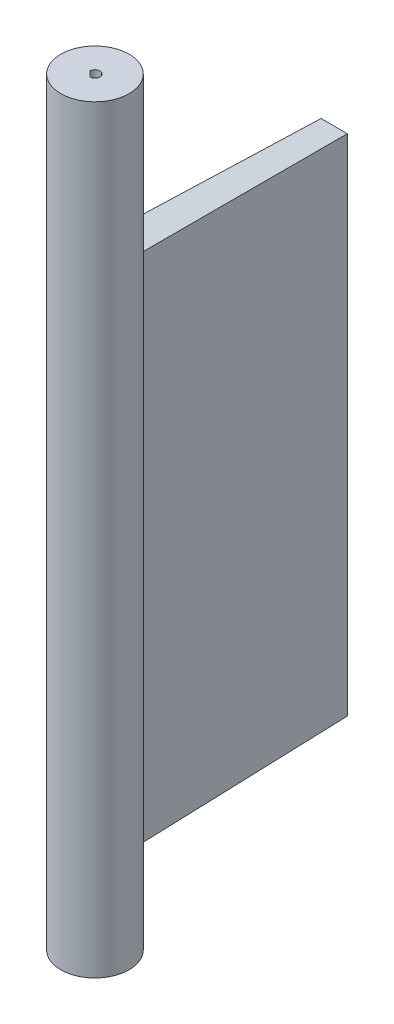
ISO-10303-21;
HEADER;
FILE_DESCRIPTION(('STEP AP214'),'2;1');
FILE_NAME('part.step','',(''),(''),'','','');
FILE_SCHEMA(('AUTOMOTIVE_DESIGN { 1 0 10303 214 1 1 1 1 }'));
ENDSEC;
DATA;
#1=APPLICATION_CONTEXT('core data for automotive mechanical design processes');
#2=APPLICATION_PROTOCOL_DEFINITION('international standard','automotive_design',2000,#1);
#3=PRODUCT_CONTEXT('',#1,'mechanical');
#4=PRODUCT('Part','Part','',(#3));
#5=PRODUCT_RELATED_PRODUCT_CATEGORY('part','',(#4));
#6=PRODUCT_DEFINITION_FORMATION('','',#4);
#7=PRODUCT_DEFINITION_CONTEXT('part definition',#1,'design');
#8=PRODUCT_DEFINITION('design','',#6,#7);
#9=PRODUCT_DEFINITION_SHAPE('','',#8);
#10=(LENGTH_UNIT() NAMED_UNIT(*) SI_UNIT(.MILLI.,.METRE.));
#11=(NAMED_UNIT(*) PLANE_ANGLE_UNIT() SI_UNIT($,.RADIAN.));
#12=(NAMED_UNIT(*) SI_UNIT($,.STERADIAN.) SOLID_ANGLE_UNIT());
#13=UNCERTAINTY_MEASURE_WITH_UNIT(LENGTH_MEASURE(1.E-05),#10,'distance_accuracy_value','');
#14=(GEOMETRIC_REPRESENTATION_CONTEXT(3) GLOBAL_UNCERTAINTY_ASSIGNED_CONTEXT((#13)) GLOBAL_UNIT_ASSIGNED_CONTEXT((#10,
#11,#12)) REPRESENTATION_CONTEXT('',''));
#15=CARTESIAN_POINT('',(0.,0.,0.));
#16=DIRECTION('',(0.,0.,1.));
#17=DIRECTION('',(1.,0.,0.));
#18=AXIS2_PLACEMENT_3D('',#15,#16,#17);
#19=CARTESIAN_POINT('',(0.,210.,0.));
#20=DIRECTION('',(0.,-1.,0.));
#21=DIRECTION('',(0.,0.,-1.));
#22=AXIS2_PLACEMENT_3D('',#19,#20,#21);
#23=CYLINDRICAL_SURFACE('',#22,10.);
#24=CARTESIAN_POINT('',(0.,175.,0.));
#25=DIRECTION('',(0.,0.999847695156391,-0.0174524064372836));
#26=DIRECTION('',(0.,-0.0174524064372836,-0.999847695156391));
#27=AXIS2_PLACEMENT_3D('',#24,#25,#26);
#28=ELLIPSE('',#27,10.0015232804391,10.);
#29=CARTESIAN_POINT('',(4.91500962575066,174.847987848727,-8.7087703138146));
#30=VERTEX_POINT('',#29);
#31=CARTESIAN_POINT('',(-4.91500962575066,174.847987848727,-8.70877031381459));
#32=VERTEX_POINT('',#31);
#33=EDGE_CURVE('E47',#30,#32,#28,.T.);
#34=ORIENTED_EDGE('',*,*,#33,.T.);
#35=DIRECTION('',(0.,-1.,0.));
#36=VECTOR('',#35,1.);
#37=CARTESIAN_POINT('',(-4.91500962575067,210.,-8.70877031381459));
#38=LINE('',#37,#36);
#39=CARTESIAN_POINT('',(-4.91500962575064,25.1520121512726,-8.7087703138146));
#40=VERTEX_POINT('',#39);
#41=EDGE_CURVE('E11',#32,#40,#38,.T.);
#42=ORIENTED_EDGE('',*,*,#41,.T.);
#43=CARTESIAN_POINT('',(0.,25.,0.));
#44=DIRECTION('',(0.,-0.999847695156391,-0.0174524064372836));
#45=DIRECTION('',(0.,-0.0174524064372836,0.999847695156391));
#46=AXIS2_PLACEMENT_3D('',#43,#44,#45);
#47=ELLIPSE('',#46,10.0015232804391,10.);
#48=CARTESIAN_POINT('',(4.91500962575068,25.1520121512726,-8.70877031381458));
#49=VERTEX_POINT('',#48);
#50=EDGE_CURVE('E155',#40,#49,#47,.T.);
#51=ORIENTED_EDGE('',*,*,#50,.T.);
#52=DIRECTION('',(0.,-1.,0.));
#53=VECTOR('',#52,1.);
#54=CARTESIAN_POINT('',(4.91500962575066,210.,-8.7087703138146));
#55=LINE('',#54,#53);
#56=EDGE_CURVE('E159',#49,#30,#55,.F.);
#57=ORIENTED_EDGE('',*,*,#56,.T.);
#58=EDGE_LOOP('',(#34,#42,#51,#57));
#59=FACE_BOUND('',#58,.T.);
#60=CARTESIAN_POINT('',(0.,0.,0.));
#61=DIRECTION('',(0.,1.,0.));
#62=DIRECTION('',(0.,0.,1.));
#63=AXIS2_PLACEMENT_3D('',#60,#61,#62);
#64=CIRCLE('',#63,10.);
#65=CARTESIAN_POINT('',(0.,0.,10.));
#66=VERTEX_POINT('',#65);
#67=EDGE_CURVE('E127',#66,#66,#64,.T.);
#68=ORIENTED_EDGE('',*,*,#67,.T.);
#69=EDGE_LOOP('',(#68));
#70=FACE_BOUND('',#69,.T.);
#71=CARTESIAN_POINT('',(0.,222.,0.));
#72=DIRECTION('',(0.,1.,0.));
#73=DIRECTION('',(0.,0.,1.));
#74=AXIS2_PLACEMENT_3D('',#71,#72,#73);
#75=CIRCLE('',#74,10.);
#76=CARTESIAN_POINT('',(0.,222.,10.));
#77=VERTEX_POINT('',#76);
#78=EDGE_CURVE('E117',#77,#77,#75,.T.);
#79=ORIENTED_EDGE('',*,*,#78,.F.);
#80=EDGE_LOOP('',(#79));
#81=FACE_BOUND('',#80,.T.);
#82=ADVANCED_FACE('F39',(#59,#70,#81),#23,.T.);
#83=CARTESIAN_POINT('',(0.,0.,0.));
#84=DIRECTION('',(0.,1.,0.));
#85=DIRECTION('',(0.,0.,1.));
#86=AXIS2_PLACEMENT_3D('',#83,#84,#85);
#87=PLANE('',#86);
#88=ORIENTED_EDGE('',*,*,#67,.F.);
#89=EDGE_LOOP('',(#88));
#90=FACE_BOUND('',#89,.T.);
#91=ADVANCED_FACE('F191',(#90),#87,.F.);
#92=CARTESIAN_POINT('',(-5.06702177702323,175.,0.));
#93=DIRECTION('',(-0.999847695156391,0.,-0.0174524064372836));
#94=DIRECTION('',(-0.0174524064372836,0.,0.999847695156391));
#95=AXIS2_PLACEMENT_3D('',#92,#93,#94);
#96=PLANE('',#95);
#97=ORIENTED_EDGE('',*,*,#41,.F.);
#98=DIRECTION('',(-0.0174497491606827,0.0174497491606827,0.999695459881887));
#99=VECTOR('',#98,1.);
#100=CARTESIAN_POINT('',(-5.06393602414165,174.996914247118,-0.176782664187466));
#101=LINE('',#100,#99);
#102=CARTESIAN_POINT('',(-3.845167232048,173.778145455025,-69.9999999999998));
#103=VERTEX_POINT('',#102);
#104=EDGE_CURVE('E123',#103,#32,#101,.T.);
#105=ORIENTED_EDGE('',*,*,#104,.F.);
#106=DIRECTION('',(0.,-1.,0.));
#107=VECTOR('',#106,1.);
#108=CARTESIAN_POINT('',(-3.845167232048,175.,-69.9999999999998));
#109=LINE('',#108,#107);
#110=CARTESIAN_POINT('',(-3.84516723204798,26.2218545449752,-69.9999999999998));
#111=VERTEX_POINT('',#110);
#112=EDGE_CURVE('E122',#103,#111,#109,.T.);
#113=ORIENTED_EDGE('',*,*,#112,.T.);
#114=DIRECTION('',(-0.0174497491606827,-0.0174497491606828,0.999695459881887));
#115=VECTOR('',#114,1.);
#116=CARTESIAN_POINT('',(-5.0213477151576,25.0456740618656,-2.61666525180185));
#117=LINE('',#116,#115);
#118=EDGE_CURVE('E129',#111,#40,#117,.T.);
#119=ORIENTED_EDGE('',*,*,#118,.T.);
#120=EDGE_LOOP('',(#97,#105,#113,#119));
#121=FACE_BOUND('',#120,.T.);
#122=ADVANCED_FACE('F177',(#121),#96,.T.);
#123=CARTESIAN_POINT('',(5.06702177702323,175.,0.));
#124=DIRECTION('',(0.999847695156391,0.,-0.0174524064372836));
#125=DIRECTION('',(-0.0174524064372836,0.,-0.999847695156391));
#126=AXIS2_PLACEMENT_3D('',#123,#124,#125);
#127=PLANE('',#126);
#128=ORIENTED_EDGE('',*,*,#56,.F.);
#129=DIRECTION('',(0.0174497491606827,-0.0174497491606827,0.999695459881887));
#130=VECTOR('',#129,1.);
#131=CARTESIAN_POINT('',(5.06702177702325,25.,0.));
#132=LINE('',#131,#130);
#133=CARTESIAN_POINT('',(3.84516723204801,26.2218545449752,-69.9999999999998));
#134=VERTEX_POINT('',#133);
#135=EDGE_CURVE('E62',#134,#49,#132,.T.);
#136=ORIENTED_EDGE('',*,*,#135,.F.);
#137=DIRECTION('',(0.,1.,0.));
#138=VECTOR('',#137,1.);
#139=CARTESIAN_POINT('',(3.845167232048,175.,-69.9999999999998));
#140=LINE('',#139,#138);
#141=CARTESIAN_POINT('',(3.845167232048,173.778145455025,-69.9999999999998));
#142=VERTEX_POINT('',#141);
#143=EDGE_CURVE('E146',#134,#142,#140,.T.);
#144=ORIENTED_EDGE('',*,*,#143,.T.);
#145=DIRECTION('',(0.0174497491606827,0.0174497491606827,0.999695459881887));
#146=VECTOR('',#145,1.);
#147=CARTESIAN_POINT('',(5.06702177702323,175.,0.));
#148=LINE('',#147,#146);
#149=EDGE_CURVE('E128',#142,#30,#148,.T.);
#150=ORIENTED_EDGE('',*,*,#149,.T.);
#151=EDGE_LOOP('',(#128,#136,#144,#150));
#152=FACE_BOUND('',#151,.T.);
#153=ADVANCED_FACE('F169',(#152),#127,.T.);
#154=CARTESIAN_POINT('',(5.06702177702323,175.,0.));
#155=DIRECTION('',(0.,0.999847695156391,-0.0174524064372836));
#156=DIRECTION('',(0.,0.0174524064372836,0.999847695156391));
#157=AXIS2_PLACEMENT_3D('',#154,#155,#156);
#158=PLANE('',#157);
#159=ORIENTED_EDGE('',*,*,#33,.F.);
#160=ORIENTED_EDGE('',*,*,#149,.F.);
#161=DIRECTION('',(-1.,0.,0.));
#162=VECTOR('',#161,1.);
#163=CARTESIAN_POINT('',(5.06702177702323,173.778145455025,-69.9999999999998));
#164=LINE('',#163,#162);
#165=EDGE_CURVE('E133',#142,#103,#164,.T.);
#166=ORIENTED_EDGE('',*,*,#165,.T.);
#167=ORIENTED_EDGE('',*,*,#104,.T.);
#168=EDGE_LOOP('',(#159,#160,#166,#167));
#169=FACE_BOUND('',#168,.T.);
#170=ADVANCED_FACE('F167',(#169),#158,.T.);
#171=CARTESIAN_POINT('',(5.06702177702325,25.,0.));
#172=DIRECTION('',(0.,-0.999847695156391,-0.0174524064372836));
#173=DIRECTION('',(0.,0.0174524064372836,-0.999847695156391));
#174=AXIS2_PLACEMENT_3D('',#171,#172,#173);
#175=PLANE('',#174);
#176=ORIENTED_EDGE('',*,*,#50,.F.);
#177=ORIENTED_EDGE('',*,*,#118,.F.);
#178=DIRECTION('',(1.,0.,0.));
#179=VECTOR('',#178,1.);
#180=CARTESIAN_POINT('',(5.06702177702325,26.2218545449752,-69.9999999999998));
#181=LINE('',#180,#179);
#182=EDGE_CURVE('E142',#111,#134,#181,.T.);
#183=ORIENTED_EDGE('',*,*,#182,.T.);
#184=ORIENTED_EDGE('',*,*,#135,.T.);
#185=EDGE_LOOP('',(#176,#177,#183,#184));
#186=FACE_BOUND('',#185,.T.);
#187=ADVANCED_FACE('F178',(#186),#175,.T.);
#188=CARTESIAN_POINT('',(0.,0.,-69.9999999999998));
#189=DIRECTION('',(0.,0.,-1.));
#190=DIRECTION('',(-1.,0.,0.));
#191=AXIS2_PLACEMENT_3D('',#188,#189,#190);
#192=PLANE('',#191);
#193=ORIENTED_EDGE('',*,*,#112,.F.);
#194=ORIENTED_EDGE('',*,*,#165,.F.);
#195=ORIENTED_EDGE('',*,*,#143,.F.);
#196=ORIENTED_EDGE('',*,*,#182,.F.);
#197=EDGE_LOOP('',(#193,#194,#195,#196));
#198=FACE_BOUND('',#197,.T.);
#199=ADVANCED_FACE('F175',(#198),#192,.T.);
#200=CARTESIAN_POINT('',(0.,222.,0.));
#201=DIRECTION('',(0.,1.,0.));
#202=DIRECTION('',(0.,0.,1.));
#203=AXIS2_PLACEMENT_3D('',#200,#201,#202);
#204=PLANE('',#203);
#205=CARTESIAN_POINT('',(0.,222.,0.));
#206=DIRECTION('',(0.,1.,0.));
#207=DIRECTION('',(0.,0.,1.));
#208=AXIS2_PLACEMENT_3D('',#205,#206,#207);
#209=CIRCLE('',#208,1.5);
#210=CARTESIAN_POINT('',(0.,222.,1.5));
#211=VERTEX_POINT('',#210);
#212=CARTESIAN_POINT('',(-1.5,222.,0.));
#213=VERTEX_POINT('',#212);
#214=EDGE_CURVE('E54',#211,#213,#209,.T.);
#215=ORIENTED_EDGE('',*,*,#214,.F.);
#216=DIRECTION('',(0.707106781186548,0.,0.707106781186548));
#217=VECTOR('',#216,1.);
#218=CARTESIAN_POINT('',(0.,222.,1.5));
#219=LINE('',#218,#217);
#220=EDGE_CURVE('E106',#213,#211,#219,.T.);
#221=ORIENTED_EDGE('',*,*,#220,.F.);
#222=EDGE_LOOP('',(#215,#221));
#223=FACE_BOUND('',#222,.T.);
#224=ORIENTED_EDGE('',*,*,#78,.T.);
#225=EDGE_LOOP('',(#224));
#226=FACE_BOUND('',#225,.T.);
#227=ADVANCED_FACE('F185',(#223,#226),#204,.T.);
#228=CARTESIAN_POINT('',(0.,212.,0.));
#229=DIRECTION('',(0.,1.,0.));
#230=DIRECTION('',(0.,0.,1.));
#231=AXIS2_PLACEMENT_3D('',#228,#229,#230);
#232=CYLINDRICAL_SURFACE('',#231,1.5);
#233=ORIENTED_EDGE('',*,*,#214,.T.);
#234=DIRECTION('',(0.,1.,0.));
#235=VECTOR('',#234,1.);
#236=CARTESIAN_POINT('',(-1.5,212.,0.));
#237=LINE('',#236,#235);
#238=CARTESIAN_POINT('',(-1.5,212.,0.));
#239=VERTEX_POINT('',#238);
#240=EDGE_CURVE('E90',#239,#213,#237,.T.);
#241=ORIENTED_EDGE('',*,*,#240,.F.);
#242=CARTESIAN_POINT('',(0.,212.,0.));
#243=DIRECTION('',(0.,1.,0.));
#244=DIRECTION('',(0.,0.,1.));
#245=AXIS2_PLACEMENT_3D('',#242,#243,#244);
#246=CIRCLE('',#245,1.5);
#247=CARTESIAN_POINT('',(0.,212.,1.5));
#248=VERTEX_POINT('',#247);
#249=EDGE_CURVE('E93',#248,#239,#246,.T.);
#250=ORIENTED_EDGE('',*,*,#249,.F.);
#251=DIRECTION('',(0.,1.,0.));
#252=VECTOR('',#251,1.);
#253=CARTESIAN_POINT('',(0.,212.,1.5));
#254=LINE('',#253,#252);
#255=EDGE_CURVE('E100',#248,#211,#254,.T.);
#256=ORIENTED_EDGE('',*,*,#255,.T.);
#257=EDGE_LOOP('',(#233,#241,#250,#256));
#258=FACE_BOUND('',#257,.T.);
#259=ADVANCED_FACE('F92',(#258),#232,.F.);
#260=CARTESIAN_POINT('',(0.,212.,1.5));
#261=DIRECTION('',(-0.707106781186548,0.,0.707106781186548));
#262=DIRECTION('',(0.707106781186548,0.,0.707106781186548));
#263=AXIS2_PLACEMENT_3D('',#260,#261,#262);
#264=PLANE('',#263);
#265=ORIENTED_EDGE('',*,*,#220,.T.);
#266=ORIENTED_EDGE('',*,*,#255,.F.);
#267=DIRECTION('',(0.707106781186548,0.,0.707106781186548));
#268=VECTOR('',#267,1.);
#269=CARTESIAN_POINT('',(0.,212.,1.5));
#270=LINE('',#269,#268);
#271=EDGE_CURVE('E101',#239,#248,#270,.T.);
#272=ORIENTED_EDGE('',*,*,#271,.F.);
#273=ORIENTED_EDGE('',*,*,#240,.T.);
#274=EDGE_LOOP('',(#265,#266,#272,#273));
#275=FACE_BOUND('',#274,.T.);
#276=ADVANCED_FACE('F108',(#275),#264,.F.);
#277=CARTESIAN_POINT('',(0.,212.,0.));
#278=DIRECTION('',(0.,1.,0.));
#279=DIRECTION('',(0.,0.,1.));
#280=AXIS2_PLACEMENT_3D('',#277,#278,#279);
#281=PLANE('',#280);
#282=ORIENTED_EDGE('',*,*,#249,.T.);
#283=ORIENTED_EDGE('',*,*,#271,.T.);
#284=EDGE_LOOP('',(#282,#283));
#285=FACE_BOUND('',#284,.T.);
#286=ADVANCED_FACE('F104',(#285),#281,.T.);
#287=CLOSED_SHELL('',(#82,#91,#122,#153,#170,#187,#199,#227,#259,#276,#286));
#288=MANIFOLD_SOLID_BREP('B2',#287);
#289=ADVANCED_BREP_SHAPE_REPRESENTATION('',(#18,#288),#14);
#290=SHAPE_DEFINITION_REPRESENTATION(#9,#289);
ENDSEC;
END-ISO-10303-21;
